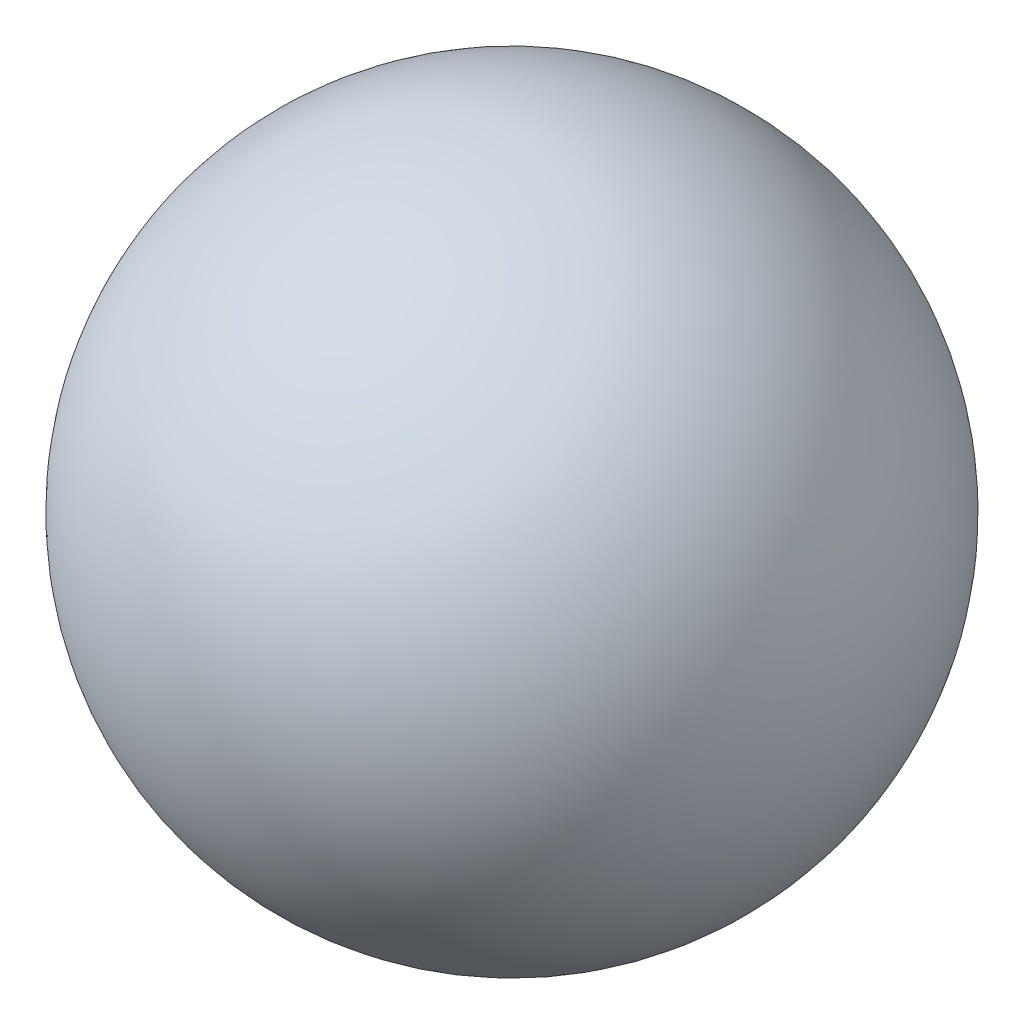
ISO-10303-21;
HEADER;
FILE_DESCRIPTION(('STEP AP214'),'2;1');
FILE_NAME('part.step','',(''),(''),'','','');
FILE_SCHEMA(('AUTOMOTIVE_DESIGN { 1 0 10303 214 1 1 1 1 }'));
ENDSEC;
DATA;
#1=APPLICATION_CONTEXT('core data for automotive mechanical design processes');
#2=APPLICATION_PROTOCOL_DEFINITION('international standard','automotive_design',2000,#1);
#3=PRODUCT_CONTEXT('',#1,'mechanical');
#4=PRODUCT('Part','Part','',(#3));
#5=PRODUCT_RELATED_PRODUCT_CATEGORY('part','',(#4));
#6=PRODUCT_DEFINITION_FORMATION('','',#4);
#7=PRODUCT_DEFINITION_CONTEXT('part definition',#1,'design');
#8=PRODUCT_DEFINITION('design','',#6,#7);
#9=PRODUCT_DEFINITION_SHAPE('','',#8);
#10=(LENGTH_UNIT() NAMED_UNIT(*) SI_UNIT(.MILLI.,.METRE.));
#11=(NAMED_UNIT(*) PLANE_ANGLE_UNIT() SI_UNIT($,.RADIAN.));
#12=(NAMED_UNIT(*) SI_UNIT($,.STERADIAN.) SOLID_ANGLE_UNIT());
#13=UNCERTAINTY_MEASURE_WITH_UNIT(LENGTH_MEASURE(1.E-05),#10,'distance_accuracy_value','');
#14=(GEOMETRIC_REPRESENTATION_CONTEXT(3) GLOBAL_UNCERTAINTY_ASSIGNED_CONTEXT((#13)) GLOBAL_UNIT_ASSIGNED_CONTEXT((#10,
#11,#12)) REPRESENTATION_CONTEXT('',''));
#15=CARTESIAN_POINT('',(0.,0.,0.));
#16=DIRECTION('',(0.,0.,1.));
#17=DIRECTION('',(1.,0.,0.));
#18=AXIS2_PLACEMENT_3D('',#15,#16,#17);
#19=CARTESIAN_POINT('',(0.,0.,0.));
#20=DIRECTION('',(-1.,0.,0.));
#21=DIRECTION('',(0.,1.,0.));
#22=AXIS2_PLACEMENT_3D('',#19,#20,#21);
#23=SPHERICAL_SURFACE('',#22,1.2446);
#24=CARTESIAN_POINT('',(-1.2446,0.,0.));
#25=VERTEX_POINT('',#24);
#26=VERTEX_LOOP('',#25);
#27=FACE_BOUND('',#26,.T.);
#28=ADVANCED_FACE('F34',(#27),#23,.T.);
#29=CLOSED_SHELL('',(#28));
#30=MANIFOLD_SOLID_BREP('B2',#29);
#31=ADVANCED_BREP_SHAPE_REPRESENTATION('',(#18,#30),#14);
#32=SHAPE_DEFINITION_REPRESENTATION(#9,#31);
ENDSEC;
END-ISO-10303-21;
